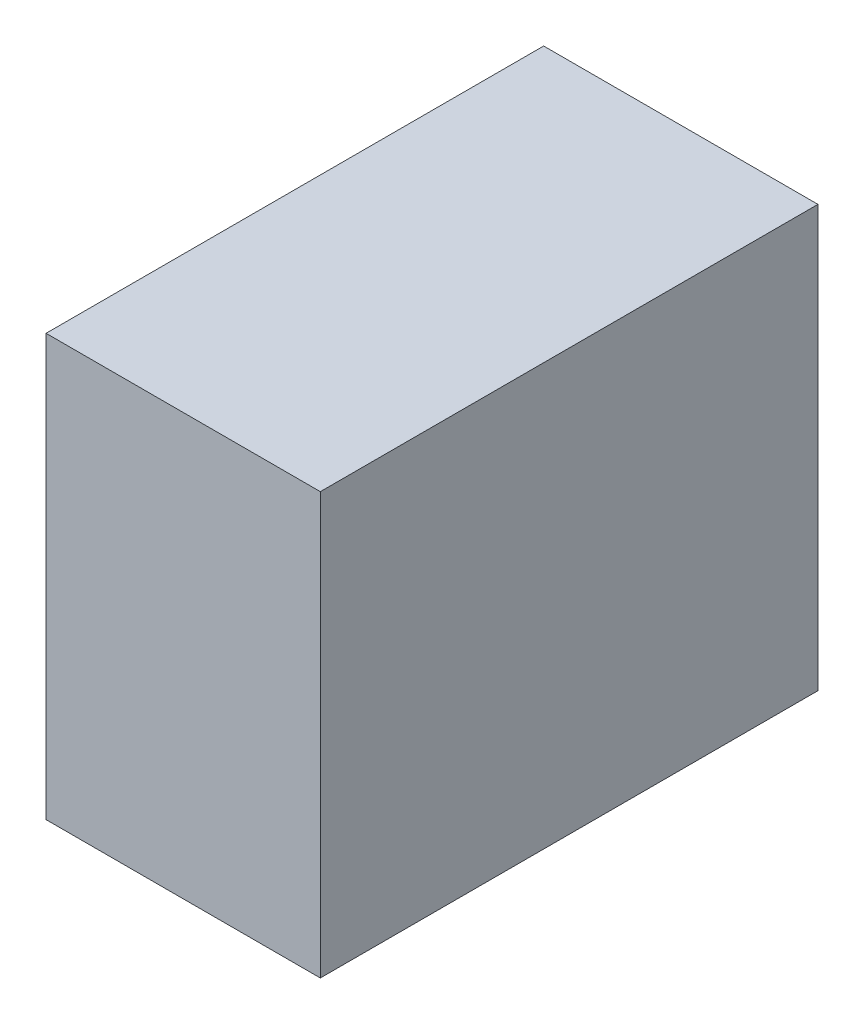
ISO-10303-21;
HEADER;
FILE_DESCRIPTION(('STEP AP214'),'2;1');
FILE_NAME('part.step','',(''),(''),'','','');
FILE_SCHEMA(('AUTOMOTIVE_DESIGN { 1 0 10303 214 1 1 1 1 }'));
ENDSEC;
DATA;
#1=APPLICATION_CONTEXT('core data for automotive mechanical design processes');
#2=APPLICATION_PROTOCOL_DEFINITION('international standard','automotive_design',2000,#1);
#3=PRODUCT_CONTEXT('',#1,'mechanical');
#4=PRODUCT('Part','Part','',(#3));
#5=PRODUCT_RELATED_PRODUCT_CATEGORY('part','',(#4));
#6=PRODUCT_DEFINITION_FORMATION('','',#4);
#7=PRODUCT_DEFINITION_CONTEXT('part definition',#1,'design');
#8=PRODUCT_DEFINITION('design','',#6,#7);
#9=PRODUCT_DEFINITION_SHAPE('','',#8);
#10=(LENGTH_UNIT() NAMED_UNIT(*) SI_UNIT(.MILLI.,.METRE.));
#11=(NAMED_UNIT(*) PLANE_ANGLE_UNIT() SI_UNIT($,.RADIAN.));
#12=(NAMED_UNIT(*) SI_UNIT($,.STERADIAN.) SOLID_ANGLE_UNIT());
#13=UNCERTAINTY_MEASURE_WITH_UNIT(LENGTH_MEASURE(1.E-05),#10,'distance_accuracy_value','');
#14=(GEOMETRIC_REPRESENTATION_CONTEXT(3) GLOBAL_UNCERTAINTY_ASSIGNED_CONTEXT((#13)) GLOBAL_UNIT_ASSIGNED_CONTEXT((#10,
#11,#12)) REPRESENTATION_CONTEXT('',''));
#15=CARTESIAN_POINT('',(0.,0.,0.));
#16=DIRECTION('',(0.,0.,1.));
#17=DIRECTION('',(1.,0.,0.));
#18=AXIS2_PLACEMENT_3D('',#15,#16,#17);
#19=CARTESIAN_POINT('',(-0.70000114,-1.07499912,0.));
#20=DIRECTION('',(-1.,0.,0.));
#21=DIRECTION('',(0.,0.,1.));
#22=AXIS2_PLACEMENT_3D('',#19,#20,#21);
#23=PLANE('',#22);
#24=DIRECTION('',(0.,0.,1.));
#25=VECTOR('',#24,1.);
#26=CARTESIAN_POINT('',(-0.70000114,1.07499912,0.));
#27=LINE('',#26,#25);
#28=CARTESIAN_POINT('',(-0.70000114,1.07499912,0.));
#29=VERTEX_POINT('',#28);
#30=CARTESIAN_POINT('',(-0.70000114,1.07499912,2.54));
#31=VERTEX_POINT('',#30);
#32=EDGE_CURVE('E20',#29,#31,#27,.T.);
#33=ORIENTED_EDGE('',*,*,#32,.F.);
#34=DIRECTION('',(0.,1.,0.));
#35=VECTOR('',#34,1.);
#36=CARTESIAN_POINT('',(-0.70000114,1.07499912,0.));
#37=LINE('',#36,#35);
#38=CARTESIAN_POINT('',(-0.70000114,-1.07499912,0.));
#39=VERTEX_POINT('',#38);
#40=EDGE_CURVE('E80',#29,#39,#37,.F.);
#41=ORIENTED_EDGE('',*,*,#40,.T.);
#42=DIRECTION('',(0.,0.,-1.));
#43=VECTOR('',#42,1.);
#44=CARTESIAN_POINT('',(-0.70000114,-1.07499912,0.));
#45=LINE('',#44,#43);
#46=CARTESIAN_POINT('',(-0.70000114,-1.07499912,2.54));
#47=VERTEX_POINT('',#46);
#48=EDGE_CURVE('E68',#47,#39,#45,.T.);
#49=ORIENTED_EDGE('',*,*,#48,.F.);
#50=DIRECTION('',(0.,1.,0.));
#51=VECTOR('',#50,1.);
#52=CARTESIAN_POINT('',(-0.70000114,1.07499912,2.54));
#53=LINE('',#52,#51);
#54=EDGE_CURVE('E56',#31,#47,#53,.F.);
#55=ORIENTED_EDGE('',*,*,#54,.F.);
#56=EDGE_LOOP('',(#33,#41,#49,#55));
#57=FACE_BOUND('',#56,.T.);
#58=ADVANCED_FACE('F17',(#57),#23,.T.);
#59=CARTESIAN_POINT('',(-0.70000114,1.07499912,0.));
#60=DIRECTION('',(0.,1.,0.));
#61=DIRECTION('',(0.,0.,1.));
#62=AXIS2_PLACEMENT_3D('',#59,#60,#61);
#63=PLANE('',#62);
#64=DIRECTION('',(0.,0.,-1.));
#65=VECTOR('',#64,1.);
#66=CARTESIAN_POINT('',(0.70000114,1.07499912,0.));
#67=LINE('',#66,#65);
#68=CARTESIAN_POINT('',(0.70000114,1.07499912,0.));
#69=VERTEX_POINT('',#68);
#70=CARTESIAN_POINT('',(0.70000114,1.07499912,2.54));
#71=VERTEX_POINT('',#70);
#72=EDGE_CURVE('E83',#69,#71,#67,.F.);
#73=ORIENTED_EDGE('',*,*,#72,.F.);
#74=DIRECTION('',(1.,0.,0.));
#75=VECTOR('',#74,1.);
#76=CARTESIAN_POINT('',(0.70000114,1.07499912,0.));
#77=LINE('',#76,#75);
#78=EDGE_CURVE('E65',#69,#29,#77,.F.);
#79=ORIENTED_EDGE('',*,*,#78,.T.);
#80=ORIENTED_EDGE('',*,*,#32,.T.);
#81=DIRECTION('',(1.,0.,0.));
#82=VECTOR('',#81,1.);
#83=CARTESIAN_POINT('',(0.70000114,1.07499912,2.54));
#84=LINE('',#83,#82);
#85=EDGE_CURVE('E62',#71,#31,#84,.F.);
#86=ORIENTED_EDGE('',*,*,#85,.F.);
#87=EDGE_LOOP('',(#73,#79,#80,#86));
#88=FACE_BOUND('',#87,.T.);
#89=ADVANCED_FACE('F61',(#88),#63,.T.);
#90=CARTESIAN_POINT('',(0.70000114,1.07499912,2.54));
#91=DIRECTION('',(0.,0.,1.));
#92=DIRECTION('',(1.,0.,0.));
#93=AXIS2_PLACEMENT_3D('',#90,#91,#92);
#94=PLANE('',#93);
#95=DIRECTION('',(1.,0.,0.));
#96=VECTOR('',#95,1.);
#97=CARTESIAN_POINT('',(0.70000114,-1.07499912,2.54));
#98=LINE('',#97,#96);
#99=CARTESIAN_POINT('',(0.70000114,-1.07499912,2.54));
#100=VERTEX_POINT('',#99);
#101=EDGE_CURVE('E70',#100,#47,#98,.F.);
#102=ORIENTED_EDGE('',*,*,#101,.F.);
#103=DIRECTION('',(0.,1.,0.));
#104=VECTOR('',#103,1.);
#105=CARTESIAN_POINT('',(0.70000114,1.07499912,2.54));
#106=LINE('',#105,#104);
#107=EDGE_CURVE('E74',#71,#100,#106,.F.);
#108=ORIENTED_EDGE('',*,*,#107,.F.);
#109=ORIENTED_EDGE('',*,*,#85,.T.);
#110=ORIENTED_EDGE('',*,*,#54,.T.);
#111=EDGE_LOOP('',(#102,#108,#109,#110));
#112=FACE_BOUND('',#111,.T.);
#113=ADVANCED_FACE('F72',(#112),#94,.T.);
#114=CARTESIAN_POINT('',(0.70000114,-1.07499912,0.));
#115=DIRECTION('',(0.,-1.,0.));
#116=DIRECTION('',(0.,0.,-1.));
#117=AXIS2_PLACEMENT_3D('',#114,#115,#116);
#118=PLANE('',#117);
#119=ORIENTED_EDGE('',*,*,#48,.T.);
#120=DIRECTION('',(1.,0.,0.));
#121=VECTOR('',#120,1.);
#122=CARTESIAN_POINT('',(0.70000114,-1.07499912,0.));
#123=LINE('',#122,#121);
#124=CARTESIAN_POINT('',(0.70000114,-1.07499912,0.));
#125=VERTEX_POINT('',#124);
#126=EDGE_CURVE('E35',#39,#125,#123,.T.);
#127=ORIENTED_EDGE('',*,*,#126,.T.);
#128=DIRECTION('',(0.,0.,-1.));
#129=VECTOR('',#128,1.);
#130=CARTESIAN_POINT('',(0.70000114,-1.07499912,0.));
#131=LINE('',#130,#129);
#132=EDGE_CURVE('E26',#100,#125,#131,.T.);
#133=ORIENTED_EDGE('',*,*,#132,.F.);
#134=ORIENTED_EDGE('',*,*,#101,.T.);
#135=EDGE_LOOP('',(#119,#127,#133,#134));
#136=FACE_BOUND('',#135,.T.);
#137=ADVANCED_FACE('F89',(#136),#118,.T.);
#138=CARTESIAN_POINT('',(0.70000114,1.07499912,0.));
#139=DIRECTION('',(0.,0.,1.));
#140=DIRECTION('',(1.,0.,0.));
#141=AXIS2_PLACEMENT_3D('',#138,#139,#140);
#142=PLANE('',#141);
#143=ORIENTED_EDGE('',*,*,#126,.F.);
#144=ORIENTED_EDGE('',*,*,#40,.F.);
#145=ORIENTED_EDGE('',*,*,#78,.F.);
#146=DIRECTION('',(0.,1.,0.));
#147=VECTOR('',#146,1.);
#148=CARTESIAN_POINT('',(0.70000114,1.07499912,0.));
#149=LINE('',#148,#147);
#150=EDGE_CURVE('E11',#125,#69,#149,.T.);
#151=ORIENTED_EDGE('',*,*,#150,.F.);
#152=EDGE_LOOP('',(#143,#144,#145,#151));
#153=FACE_BOUND('',#152,.T.);
#154=ADVANCED_FACE('F91',(#153),#142,.F.);
#155=CARTESIAN_POINT('',(0.70000114,1.07499912,0.));
#156=DIRECTION('',(1.,0.,0.));
#157=DIRECTION('',(0.,0.,-1.));
#158=AXIS2_PLACEMENT_3D('',#155,#156,#157);
#159=PLANE('',#158);
#160=ORIENTED_EDGE('',*,*,#132,.T.);
#161=ORIENTED_EDGE('',*,*,#150,.T.);
#162=ORIENTED_EDGE('',*,*,#72,.T.);
#163=ORIENTED_EDGE('',*,*,#107,.T.);
#164=EDGE_LOOP('',(#160,#161,#162,#163));
#165=FACE_BOUND('',#164,.T.);
#166=ADVANCED_FACE('F88',(#165),#159,.T.);
#167=CLOSED_SHELL('',(#58,#89,#113,#137,#154,#166));
#168=MANIFOLD_SOLID_BREP('B1',#167);
#169=ADVANCED_BREP_SHAPE_REPRESENTATION('',(#18,#168),#14);
#170=SHAPE_DEFINITION_REPRESENTATION(#9,#169);
ENDSEC;
END-ISO-10303-21;
